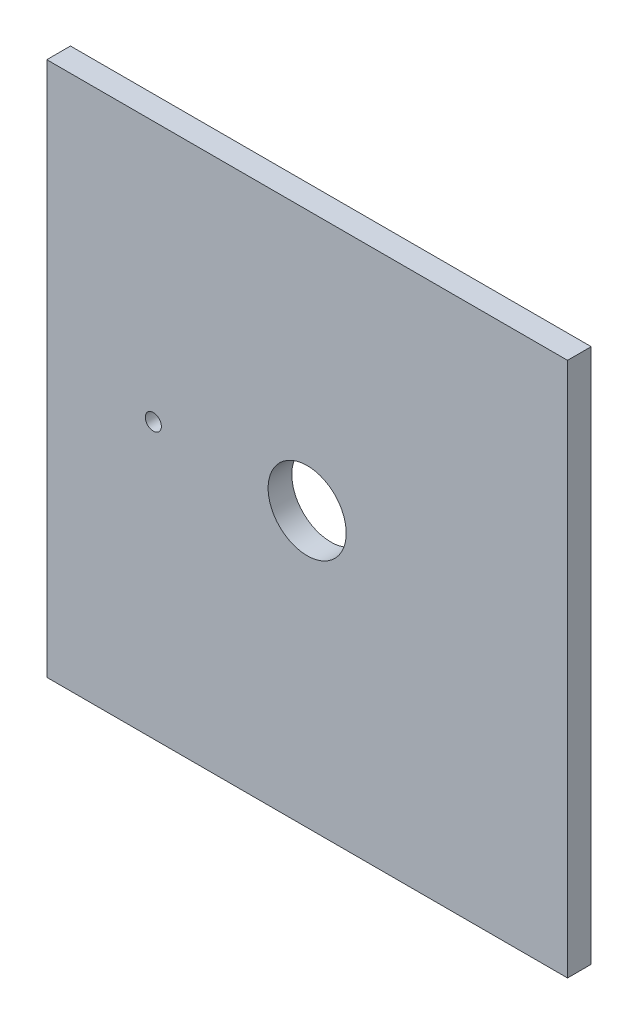
ISO-10303-21;
HEADER;
FILE_DESCRIPTION(('STEP AP214'),'2;1');
FILE_NAME('part.step','',(''),(''),'','','');
FILE_SCHEMA(('AUTOMOTIVE_DESIGN { 1 0 10303 214 1 1 1 1 }'));
ENDSEC;
DATA;
#1=APPLICATION_CONTEXT('core data for automotive mechanical design processes');
#2=APPLICATION_PROTOCOL_DEFINITION('international standard','automotive_design',2000,#1);
#3=PRODUCT_CONTEXT('',#1,'mechanical');
#4=PRODUCT('Part','Part','',(#3));
#5=PRODUCT_RELATED_PRODUCT_CATEGORY('part','',(#4));
#6=PRODUCT_DEFINITION_FORMATION('','',#4);
#7=PRODUCT_DEFINITION_CONTEXT('part definition',#1,'design');
#8=PRODUCT_DEFINITION('design','',#6,#7);
#9=PRODUCT_DEFINITION_SHAPE('','',#8);
#10=(LENGTH_UNIT() NAMED_UNIT(*) SI_UNIT(.MILLI.,.METRE.));
#11=(NAMED_UNIT(*) PLANE_ANGLE_UNIT() SI_UNIT($,.RADIAN.));
#12=(NAMED_UNIT(*) SI_UNIT($,.STERADIAN.) SOLID_ANGLE_UNIT());
#13=UNCERTAINTY_MEASURE_WITH_UNIT(LENGTH_MEASURE(1.E-05),#10,'distance_accuracy_value','');
#14=(GEOMETRIC_REPRESENTATION_CONTEXT(3) GLOBAL_UNCERTAINTY_ASSIGNED_CONTEXT((#13)) GLOBAL_UNIT_ASSIGNED_CONTEXT((#10,
#11,#12)) REPRESENTATION_CONTEXT('',''));
#15=CARTESIAN_POINT('',(0.,0.,0.));
#16=DIRECTION('',(0.,0.,1.));
#17=DIRECTION('',(1.,0.,0.));
#18=AXIS2_PLACEMENT_3D('',#15,#16,#17);
#19=CARTESIAN_POINT('',(0.,0.,299.));
#20=DIRECTION('',(0.,0.,1.));
#21=DIRECTION('',(1.,0.,0.));
#22=AXIS2_PLACEMENT_3D('',#19,#20,#21);
#23=CYLINDRICAL_SURFACE('',#22,16.5);
#24=DIRECTION('',(0.,0.,1.));
#25=VECTOR('',#24,1.);
#26=CARTESIAN_POINT('',(16.5,0.,299.));
#27=LINE('',#26,#25);
#28=CARTESIAN_POINT('',(16.5,0.,300.));
#29=VERTEX_POINT('',#28);
#30=CARTESIAN_POINT('',(16.5,0.,310.));
#31=VERTEX_POINT('',#30);
#32=EDGE_CURVE('E10',#29,#31,#27,.T.);
#33=ORIENTED_EDGE('',*,*,#32,.F.);
#34=CARTESIAN_POINT('',(0.,0.,300.));
#35=DIRECTION('',(0.,0.,1.));
#36=DIRECTION('',(1.,0.,0.));
#37=AXIS2_PLACEMENT_3D('',#34,#35,#36);
#38=CIRCLE('',#37,16.5);
#39=EDGE_CURVE('E20',#29,#29,#38,.T.);
#40=ORIENTED_EDGE('',*,*,#39,.F.);
#41=ORIENTED_EDGE('',*,*,#32,.T.);
#42=CARTESIAN_POINT('',(0.,0.,310.));
#43=DIRECTION('',(0.,0.,1.));
#44=DIRECTION('',(1.,0.,0.));
#45=AXIS2_PLACEMENT_3D('',#42,#43,#44);
#46=CIRCLE('',#45,16.5);
#47=EDGE_CURVE('E233',#31,#31,#46,.T.);
#48=ORIENTED_EDGE('',*,*,#47,.T.);
#49=EDGE_LOOP('',(#33,#40,#41,#48));
#50=FACE_BOUND('',#49,.T.);
#51=ADVANCED_FACE('F16',(#50),#23,.F.);
#52=CARTESIAN_POINT('',(-65.,0.,299.));
#53=DIRECTION('',(0.,0.,1.));
#54=DIRECTION('',(1.,0.,0.));
#55=AXIS2_PLACEMENT_3D('',#52,#53,#54);
#56=CYLINDRICAL_SURFACE('',#55,3.4);
#57=DIRECTION('',(0.,0.,1.));
#58=VECTOR('',#57,1.);
#59=CARTESIAN_POINT('',(-61.6,0.,299.));
#60=LINE('',#59,#58);
#61=CARTESIAN_POINT('',(-61.6,0.,300.));
#62=VERTEX_POINT('',#61);
#63=CARTESIAN_POINT('',(-61.6,0.,310.));
#64=VERTEX_POINT('',#63);
#65=EDGE_CURVE('E27',#62,#64,#60,.T.);
#66=ORIENTED_EDGE('',*,*,#65,.F.);
#67=CARTESIAN_POINT('',(-65.,0.,300.));
#68=DIRECTION('',(0.,0.,1.));
#69=DIRECTION('',(1.,0.,0.));
#70=AXIS2_PLACEMENT_3D('',#67,#68,#69);
#71=CIRCLE('',#70,3.4);
#72=EDGE_CURVE('E112',#62,#62,#71,.T.);
#73=ORIENTED_EDGE('',*,*,#72,.F.);
#74=ORIENTED_EDGE('',*,*,#65,.T.);
#75=CARTESIAN_POINT('',(-65.,0.,310.));
#76=DIRECTION('',(0.,0.,1.));
#77=DIRECTION('',(1.,0.,0.));
#78=AXIS2_PLACEMENT_3D('',#75,#76,#77);
#79=CIRCLE('',#78,3.4);
#80=EDGE_CURVE('E218',#64,#64,#79,.T.);
#81=ORIENTED_EDGE('',*,*,#80,.T.);
#82=EDGE_LOOP('',(#66,#73,#74,#81));
#83=FACE_BOUND('',#82,.T.);
#84=ADVANCED_FACE('F159',(#83),#56,.F.);
#85=CARTESIAN_POINT('',(110.,-116.,300.));
#86=DIRECTION('',(1.,0.,0.));
#87=DIRECTION('',(0.,1.,0.));
#88=AXIS2_PLACEMENT_3D('',#85,#86,#87);
#89=PLANE('',#88);
#90=DIRECTION('',(0.,0.,1.));
#91=VECTOR('',#90,1.);
#92=CARTESIAN_POINT('',(110.,-116.,300.));
#93=LINE('',#92,#91);
#94=CARTESIAN_POINT('',(110.,-116.,300.));
#95=VERTEX_POINT('',#94);
#96=CARTESIAN_POINT('',(110.,-116.,310.));
#97=VERTEX_POINT('',#96);
#98=EDGE_CURVE('E89',#95,#97,#93,.T.);
#99=ORIENTED_EDGE('',*,*,#98,.F.);
#100=DIRECTION('',(0.,1.,0.));
#101=VECTOR('',#100,1.);
#102=CARTESIAN_POINT('',(110.,-116.,300.));
#103=LINE('',#102,#101);
#104=CARTESIAN_POINT('',(110.,110.,300.));
#105=VERTEX_POINT('',#104);
#106=EDGE_CURVE('E118',#95,#105,#103,.T.);
#107=ORIENTED_EDGE('',*,*,#106,.T.);
#108=DIRECTION('',(0.,0.,1.));
#109=VECTOR('',#108,1.);
#110=CARTESIAN_POINT('',(110.,110.,300.));
#111=LINE('',#110,#109);
#112=CARTESIAN_POINT('',(110.,110.,310.));
#113=VERTEX_POINT('',#112);
#114=EDGE_CURVE('E121',#105,#113,#111,.T.);
#115=ORIENTED_EDGE('',*,*,#114,.T.);
#116=DIRECTION('',(0.,1.,0.));
#117=VECTOR('',#116,1.);
#118=CARTESIAN_POINT('',(110.,-116.,310.));
#119=LINE('',#118,#117);
#120=EDGE_CURVE('E114',#97,#113,#119,.T.);
#121=ORIENTED_EDGE('',*,*,#120,.F.);
#122=EDGE_LOOP('',(#99,#107,#115,#121));
#123=FACE_BOUND('',#122,.T.);
#124=ADVANCED_FACE('F154',(#123),#89,.T.);
#125=CARTESIAN_POINT('',(-110.,-116.,300.));
#126=DIRECTION('',(0.,0.,1.));
#127=DIRECTION('',(1.,0.,0.));
#128=AXIS2_PLACEMENT_3D('',#125,#126,#127);
#129=PLANE('',#128);
#130=ORIENTED_EDGE('',*,*,#39,.T.);
#131=EDGE_LOOP('',(#130));
#132=FACE_BOUND('',#131,.T.);
#133=ORIENTED_EDGE('',*,*,#72,.T.);
#134=EDGE_LOOP('',(#133));
#135=FACE_BOUND('',#134,.T.);
#136=DIRECTION('',(1.,0.,0.));
#137=VECTOR('',#136,1.);
#138=CARTESIAN_POINT('',(-110.,110.,300.));
#139=LINE('',#138,#137);
#140=CARTESIAN_POINT('',(-110.,110.,300.));
#141=VERTEX_POINT('',#140);
#142=EDGE_CURVE('E230',#141,#105,#139,.T.);
#143=ORIENTED_EDGE('',*,*,#142,.T.);
#144=ORIENTED_EDGE('',*,*,#106,.F.);
#145=DIRECTION('',(1.,0.,0.));
#146=VECTOR('',#145,1.);
#147=CARTESIAN_POINT('',(-110.,-116.,300.));
#148=LINE('',#147,#146);
#149=CARTESIAN_POINT('',(-110.,-116.,300.));
#150=VERTEX_POINT('',#149);
#151=EDGE_CURVE('E91',#150,#95,#148,.T.);
#152=ORIENTED_EDGE('',*,*,#151,.F.);
#153=DIRECTION('',(0.,1.,0.));
#154=VECTOR('',#153,1.);
#155=CARTESIAN_POINT('',(-110.,-116.,300.));
#156=LINE('',#155,#154);
#157=EDGE_CURVE('E99',#150,#141,#156,.T.);
#158=ORIENTED_EDGE('',*,*,#157,.T.);
#159=EDGE_LOOP('',(#143,#144,#152,#158));
#160=FACE_BOUND('',#159,.T.);
#161=ADVANCED_FACE('F147',(#132,#135,#160),#129,.F.);
#162=CARTESIAN_POINT('',(-110.,110.,300.));
#163=DIRECTION('',(0.,1.,0.));
#164=DIRECTION('',(1.,0.,0.));
#165=AXIS2_PLACEMENT_3D('',#162,#163,#164);
#166=PLANE('',#165);
#167=ORIENTED_EDGE('',*,*,#142,.F.);
#168=DIRECTION('',(0.,0.,1.));
#169=VECTOR('',#168,1.);
#170=CARTESIAN_POINT('',(-110.,110.,300.));
#171=LINE('',#170,#169);
#172=CARTESIAN_POINT('',(-110.,110.,310.));
#173=VERTEX_POINT('',#172);
#174=EDGE_CURVE('E103',#141,#173,#171,.T.);
#175=ORIENTED_EDGE('',*,*,#174,.T.);
#176=DIRECTION('',(1.,0.,0.));
#177=VECTOR('',#176,1.);
#178=CARTESIAN_POINT('',(-110.,110.,310.));
#179=LINE('',#178,#177);
#180=EDGE_CURVE('E74',#173,#113,#179,.T.);
#181=ORIENTED_EDGE('',*,*,#180,.T.);
#182=ORIENTED_EDGE('',*,*,#114,.F.);
#183=EDGE_LOOP('',(#167,#175,#181,#182));
#184=FACE_BOUND('',#183,.T.);
#185=ADVANCED_FACE('F135',(#184),#166,.T.);
#186=CARTESIAN_POINT('',(-110.,-116.,310.));
#187=DIRECTION('',(0.,0.,1.));
#188=DIRECTION('',(1.,0.,0.));
#189=AXIS2_PLACEMENT_3D('',#186,#187,#188);
#190=PLANE('',#189);
#191=ORIENTED_EDGE('',*,*,#47,.F.);
#192=EDGE_LOOP('',(#191));
#193=FACE_BOUND('',#192,.T.);
#194=ORIENTED_EDGE('',*,*,#80,.F.);
#195=EDGE_LOOP('',(#194));
#196=FACE_BOUND('',#195,.T.);
#197=DIRECTION('',(0.,1.,0.));
#198=VECTOR('',#197,1.);
#199=CARTESIAN_POINT('',(-110.,-116.,310.));
#200=LINE('',#199,#198);
#201=CARTESIAN_POINT('',(-110.,-116.,310.));
#202=VERTEX_POINT('',#201);
#203=EDGE_CURVE('E97',#202,#173,#200,.T.);
#204=ORIENTED_EDGE('',*,*,#203,.F.);
#205=DIRECTION('',(1.,0.,0.));
#206=VECTOR('',#205,1.);
#207=CARTESIAN_POINT('',(-110.,-116.,310.));
#208=LINE('',#207,#206);
#209=EDGE_CURVE('E83',#202,#97,#208,.T.);
#210=ORIENTED_EDGE('',*,*,#209,.T.);
#211=ORIENTED_EDGE('',*,*,#120,.T.);
#212=ORIENTED_EDGE('',*,*,#180,.F.);
#213=EDGE_LOOP('',(#204,#210,#211,#212));
#214=FACE_BOUND('',#213,.T.);
#215=ADVANCED_FACE('F101',(#193,#196,#214),#190,.T.);
#216=CARTESIAN_POINT('',(-110.,-116.,300.));
#217=DIRECTION('',(0.,1.,0.));
#218=DIRECTION('',(1.,0.,0.));
#219=AXIS2_PLACEMENT_3D('',#216,#217,#218);
#220=PLANE('',#219);
#221=ORIENTED_EDGE('',*,*,#98,.T.);
#222=ORIENTED_EDGE('',*,*,#209,.F.);
#223=DIRECTION('',(0.,0.,1.));
#224=VECTOR('',#223,1.);
#225=CARTESIAN_POINT('',(-110.,-116.,300.));
#226=LINE('',#225,#224);
#227=EDGE_CURVE('E86',#150,#202,#226,.T.);
#228=ORIENTED_EDGE('',*,*,#227,.F.);
#229=ORIENTED_EDGE('',*,*,#151,.T.);
#230=EDGE_LOOP('',(#221,#222,#228,#229));
#231=FACE_BOUND('',#230,.T.);
#232=ADVANCED_FACE('F18',(#231),#220,.F.);
#233=CARTESIAN_POINT('',(-110.,-116.,300.));
#234=DIRECTION('',(1.,0.,0.));
#235=DIRECTION('',(0.,1.,0.));
#236=AXIS2_PLACEMENT_3D('',#233,#234,#235);
#237=PLANE('',#236);
#238=ORIENTED_EDGE('',*,*,#203,.T.);
#239=ORIENTED_EDGE('',*,*,#174,.F.);
#240=ORIENTED_EDGE('',*,*,#157,.F.);
#241=ORIENTED_EDGE('',*,*,#227,.T.);
#242=EDGE_LOOP('',(#238,#239,#240,#241));
#243=FACE_BOUND('',#242,.T.);
#244=ADVANCED_FACE('F95',(#243),#237,.F.);
#245=CLOSED_SHELL('',(#51,#84,#124,#161,#185,#215,#232,#244));
#246=MANIFOLD_SOLID_BREP('B1',#245);
#247=ADVANCED_BREP_SHAPE_REPRESENTATION('',(#18,#246),#14);
#248=SHAPE_DEFINITION_REPRESENTATION(#9,#247);
ENDSEC;
END-ISO-10303-21;
